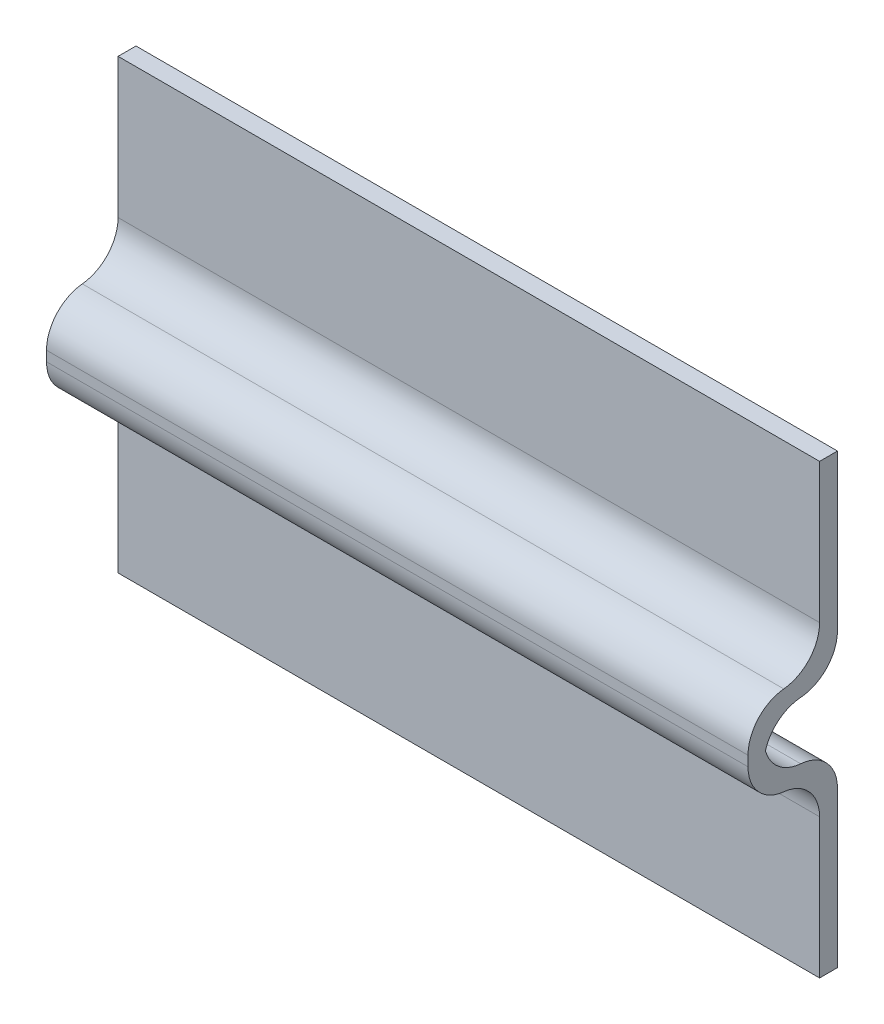
ISO-10303-21;
HEADER;
FILE_DESCRIPTION(('STEP AP214'),'2;1');
FILE_NAME('part.step','',(''),(''),'','','');
FILE_SCHEMA(('AUTOMOTIVE_DESIGN { 1 0 10303 214 1 1 1 1 }'));
ENDSEC;
DATA;
#1=APPLICATION_CONTEXT('core data for automotive mechanical design processes');
#2=APPLICATION_PROTOCOL_DEFINITION('international standard','automotive_design',2000,#1);
#3=PRODUCT_CONTEXT('',#1,'mechanical');
#4=PRODUCT('Part','Part','',(#3));
#5=PRODUCT_RELATED_PRODUCT_CATEGORY('part','',(#4));
#6=PRODUCT_DEFINITION_FORMATION('','',#4);
#7=PRODUCT_DEFINITION_CONTEXT('part definition',#1,'design');
#8=PRODUCT_DEFINITION('design','',#6,#7);
#9=PRODUCT_DEFINITION_SHAPE('','',#8);
#10=(LENGTH_UNIT() NAMED_UNIT(*) SI_UNIT(.MILLI.,.METRE.));
#11=(NAMED_UNIT(*) PLANE_ANGLE_UNIT() SI_UNIT($,.RADIAN.));
#12=(NAMED_UNIT(*) SI_UNIT($,.STERADIAN.) SOLID_ANGLE_UNIT());
#13=UNCERTAINTY_MEASURE_WITH_UNIT(LENGTH_MEASURE(1.E-05),#10,'distance_accuracy_value','');
#14=(GEOMETRIC_REPRESENTATION_CONTEXT(3) GLOBAL_UNCERTAINTY_ASSIGNED_CONTEXT((#13)) GLOBAL_UNIT_ASSIGNED_CONTEXT((#10,
#11,#12)) REPRESENTATION_CONTEXT('',''));
#15=CARTESIAN_POINT('',(0.,0.,0.));
#16=DIRECTION('',(0.,0.,1.));
#17=DIRECTION('',(1.,0.,0.));
#18=AXIS2_PLACEMENT_3D('',#15,#16,#17);
#19=CARTESIAN_POINT('',(-88.265,0.,0.));
#20=DIRECTION('',(0.,0.,-1.));
#21=DIRECTION('',(0.,1.,0.));
#22=AXIS2_PLACEMENT_3D('',#19,#20,#21);
#23=PLANE('',#22);
#24=DIRECTION('',(0.,1.,0.));
#25=VECTOR('',#24,1.);
#26=CARTESIAN_POINT('',(-88.265,0.,0.));
#27=LINE('',#26,#25);
#28=CARTESIAN_POINT('',(-88.265,0.,0.));
#29=VERTEX_POINT('',#28);
#30=CARTESIAN_POINT('',(-88.265,39.0937012998243,0.));
#31=VERTEX_POINT('',#30);
#32=EDGE_CURVE('E161',#29,#31,#27,.T.);
#33=ORIENTED_EDGE('',*,*,#32,.T.);
#34=DIRECTION('',(1.,0.,0.));
#35=VECTOR('',#34,1.);
#36=CARTESIAN_POINT('',(88.265,39.0937012998243,0.));
#37=LINE('',#36,#35);
#38=CARTESIAN_POINT('',(88.265,39.0937012998243,0.));
#39=VERTEX_POINT('',#38);
#40=EDGE_CURVE('E247',#31,#39,#37,.T.);
#41=ORIENTED_EDGE('',*,*,#40,.T.);
#42=DIRECTION('',(0.,1.,0.));
#43=VECTOR('',#42,1.);
#44=CARTESIAN_POINT('',(88.265,0.,0.));
#45=LINE('',#44,#43);
#46=CARTESIAN_POINT('',(88.265,0.,0.));
#47=VERTEX_POINT('',#46);
#48=EDGE_CURVE('E186',#47,#39,#45,.T.);
#49=ORIENTED_EDGE('',*,*,#48,.F.);
#50=DIRECTION('',(1.,0.,0.));
#51=VECTOR('',#50,1.);
#52=CARTESIAN_POINT('',(-88.265,0.,0.));
#53=LINE('',#52,#51);
#54=EDGE_CURVE('E203',#29,#47,#53,.T.);
#55=ORIENTED_EDGE('',*,*,#54,.F.);
#56=EDGE_LOOP('',(#33,#41,#49,#55));
#57=FACE_BOUND('',#56,.T.);
#58=ADVANCED_FACE('F43',(#57),#23,.T.);
#59=CARTESIAN_POINT('',(-88.265,0.,0.));
#60=DIRECTION('',(0.,-1.,0.));
#61=DIRECTION('',(0.,0.,-1.));
#62=AXIS2_PLACEMENT_3D('',#59,#60,#61);
#63=PLANE('',#62);
#64=DIRECTION('',(0.,0.,-1.));
#65=VECTOR('',#64,1.);
#66=CARTESIAN_POINT('',(88.265,0.,0.));
#67=LINE('',#66,#65);
#68=CARTESIAN_POINT('',(88.265,0.,4.50388224287594));
#69=VERTEX_POINT('',#68);
#70=EDGE_CURVE('E200',#69,#47,#67,.T.);
#71=ORIENTED_EDGE('',*,*,#70,.F.);
#72=DIRECTION('',(1.,0.,0.));
#73=VECTOR('',#72,1.);
#74=CARTESIAN_POINT('',(-88.265,0.,4.50388224287594));
#75=LINE('',#74,#73);
#76=CARTESIAN_POINT('',(-88.265,0.,4.50388224287594));
#77=VERTEX_POINT('',#76);
#78=EDGE_CURVE('E206',#77,#69,#75,.T.);
#79=ORIENTED_EDGE('',*,*,#78,.F.);
#80=DIRECTION('',(0.,0.,-1.));
#81=VECTOR('',#80,1.);
#82=CARTESIAN_POINT('',(-88.265,0.,0.));
#83=LINE('',#82,#81);
#84=EDGE_CURVE('E169',#77,#29,#83,.T.);
#85=ORIENTED_EDGE('',*,*,#84,.T.);
#86=ORIENTED_EDGE('',*,*,#54,.T.);
#87=EDGE_LOOP('',(#71,#79,#85,#86));
#88=FACE_BOUND('',#87,.T.);
#89=ADVANCED_FACE('F296',(#88),#63,.T.);
#90=CARTESIAN_POINT('',(-88.265,0.,4.50388224287594));
#91=DIRECTION('',(0.,0.,1.));
#92=DIRECTION('',(0.,-1.,0.));
#93=AXIS2_PLACEMENT_3D('',#90,#91,#92);
#94=PLANE('',#93);
#95=DIRECTION('',(0.,-1.,0.));
#96=VECTOR('',#95,1.);
#97=CARTESIAN_POINT('',(88.265,0.,4.50388224287594));
#98=LINE('',#97,#96);
#99=CARTESIAN_POINT('',(88.265,35.1375190860871,4.50388224287594));
#100=VERTEX_POINT('',#99);
#101=EDGE_CURVE('E198',#100,#69,#98,.T.);
#102=ORIENTED_EDGE('',*,*,#101,.F.);
#103=DIRECTION('',(-1.,0.,0.));
#104=VECTOR('',#103,1.);
#105=CARTESIAN_POINT('',(-88.265,35.1375190860871,4.50388224287594));
#106=LINE('',#105,#104);
#107=CARTESIAN_POINT('',(-88.265,35.1375190860871,4.50388224287594));
#108=VERTEX_POINT('',#107);
#109=EDGE_CURVE('E255',#100,#108,#106,.T.);
#110=ORIENTED_EDGE('',*,*,#109,.T.);
#111=DIRECTION('',(0.,-1.,0.));
#112=VECTOR('',#111,1.);
#113=CARTESIAN_POINT('',(-88.265,0.,4.50388224287594));
#114=LINE('',#113,#112);
#115=EDGE_CURVE('E182',#108,#77,#114,.T.);
#116=ORIENTED_EDGE('',*,*,#115,.T.);
#117=ORIENTED_EDGE('',*,*,#78,.T.);
#118=EDGE_LOOP('',(#102,#110,#116,#117));
#119=FACE_BOUND('',#118,.T.);
#120=ADVANCED_FACE('F327',(#119),#94,.T.);
#121=CARTESIAN_POINT('',(-88.265,67.5582336431391,22.5194112143797));
#122=DIRECTION('',(0.,0.,1.));
#123=DIRECTION('',(1.,0.,0.));
#124=AXIS2_PLACEMENT_3D('',#121,#122,#123);
#125=PLANE('',#124);
#126=DIRECTION('',(0.,-1.,0.));
#127=VECTOR('',#126,1.);
#128=CARTESIAN_POINT('',(-88.265,67.5582336431391,22.5194112143797));
#129=LINE('',#128,#127);
#130=CARTESIAN_POINT('',(-88.265,57.5582336431391,22.5194112143797));
#131=VERTEX_POINT('',#130);
#132=CARTESIAN_POINT('',(-88.265,55.0388224287594,22.5194112143797));
#133=VERTEX_POINT('',#132);
#134=EDGE_CURVE('E176',#131,#133,#129,.T.);
#135=ORIENTED_EDGE('',*,*,#134,.T.);
#136=DIRECTION('',(1.,0.,0.));
#137=VECTOR('',#136,1.);
#138=CARTESIAN_POINT('',(-88.265,55.0388224287594,22.5194112143797));
#139=LINE('',#138,#137);
#140=CARTESIAN_POINT('',(88.265,55.0388224287594,22.5194112143797));
#141=VERTEX_POINT('',#140);
#142=EDGE_CURVE('E211',#133,#141,#139,.T.);
#143=ORIENTED_EDGE('',*,*,#142,.T.);
#144=DIRECTION('',(0.,-1.,0.));
#145=VECTOR('',#144,1.);
#146=CARTESIAN_POINT('',(88.265,67.5582336431391,22.5194112143797));
#147=LINE('',#146,#145);
#148=CARTESIAN_POINT('',(88.265,57.5582336431391,22.5194112143797));
#149=VERTEX_POINT('',#148);
#150=EDGE_CURVE('E195',#149,#141,#147,.T.);
#151=ORIENTED_EDGE('',*,*,#150,.F.);
#152=DIRECTION('',(1.,0.,0.));
#153=VECTOR('',#152,1.);
#154=CARTESIAN_POINT('',(-88.265,57.5582336431391,22.5194112143797));
#155=LINE('',#154,#153);
#156=EDGE_CURVE('E205',#149,#131,#155,.F.);
#157=ORIENTED_EDGE('',*,*,#156,.T.);
#158=EDGE_LOOP('',(#135,#143,#151,#157));
#159=FACE_BOUND('',#158,.T.);
#160=ADVANCED_FACE('F312',(#159),#125,.T.);
#161=CARTESIAN_POINT('',(-88.265,67.5582336431391,4.50388224287594));
#162=DIRECTION('',(0.,0.,1.));
#163=DIRECTION('',(0.,-1.,0.));
#164=AXIS2_PLACEMENT_3D('',#161,#162,#163);
#165=PLANE('',#164);
#166=DIRECTION('',(0.,-1.,0.));
#167=VECTOR('',#166,1.);
#168=CARTESIAN_POINT('',(-88.265,67.5582336431391,4.50388224287594));
#169=LINE('',#168,#167);
#170=CARTESIAN_POINT('',(-88.265,112.597056071899,4.50388224287594));
#171=VERTEX_POINT('',#170);
#172=CARTESIAN_POINT('',(-88.265,77.4595369858114,4.50388224287594));
#173=VERTEX_POINT('',#172);
#174=EDGE_CURVE('E174',#171,#173,#169,.T.);
#175=ORIENTED_EDGE('',*,*,#174,.T.);
#176=DIRECTION('',(-1.,0.,0.));
#177=VECTOR('',#176,1.);
#178=CARTESIAN_POINT('',(88.265,77.4595369858114,4.50388224287594));
#179=LINE('',#178,#177);
#180=CARTESIAN_POINT('',(88.265,77.4595369858114,4.50388224287594));
#181=VERTEX_POINT('',#180);
#182=EDGE_CURVE('E261',#173,#181,#179,.F.);
#183=ORIENTED_EDGE('',*,*,#182,.T.);
#184=DIRECTION('',(0.,-1.,0.));
#185=VECTOR('',#184,1.);
#186=CARTESIAN_POINT('',(88.265,67.5582336431391,4.50388224287594));
#187=LINE('',#186,#185);
#188=CARTESIAN_POINT('',(88.265,112.597056071899,4.50388224287594));
#189=VERTEX_POINT('',#188);
#190=EDGE_CURVE('E193',#189,#181,#187,.T.);
#191=ORIENTED_EDGE('',*,*,#190,.F.);
#192=DIRECTION('',(1.,0.,0.));
#193=VECTOR('',#192,1.);
#194=CARTESIAN_POINT('',(-88.265,112.597056071899,4.50388224287594));
#195=LINE('',#194,#193);
#196=EDGE_CURVE('E168',#171,#189,#195,.T.);
#197=ORIENTED_EDGE('',*,*,#196,.F.);
#198=EDGE_LOOP('',(#175,#183,#191,#197));
#199=FACE_BOUND('',#198,.T.);
#200=ADVANCED_FACE('F267',(#199),#165,.T.);
#201=CARTESIAN_POINT('',(-88.265,112.597056071899,0.));
#202=DIRECTION('',(0.,1.,0.));
#203=DIRECTION('',(0.,0.,1.));
#204=AXIS2_PLACEMENT_3D('',#201,#202,#203);
#205=PLANE('',#204);
#206=DIRECTION('',(0.,0.,1.));
#207=VECTOR('',#206,1.);
#208=CARTESIAN_POINT('',(88.265,112.597056071899,0.));
#209=LINE('',#208,#207);
#210=CARTESIAN_POINT('',(88.265,112.597056071899,0.));
#211=VERTEX_POINT('',#210);
#212=EDGE_CURVE('E167',#211,#189,#209,.T.);
#213=ORIENTED_EDGE('',*,*,#212,.F.);
#214=DIRECTION('',(1.,0.,0.));
#215=VECTOR('',#214,1.);
#216=CARTESIAN_POINT('',(-88.265,112.597056071899,0.));
#217=LINE('',#216,#215);
#218=CARTESIAN_POINT('',(-88.265,112.597056071899,0.));
#219=VERTEX_POINT('',#218);
#220=EDGE_CURVE('E153',#219,#211,#217,.T.);
#221=ORIENTED_EDGE('',*,*,#220,.F.);
#222=DIRECTION('',(0.,0.,1.));
#223=VECTOR('',#222,1.);
#224=CARTESIAN_POINT('',(-88.265,112.597056071899,0.));
#225=LINE('',#224,#223);
#226=EDGE_CURVE('E160',#219,#171,#225,.T.);
#227=ORIENTED_EDGE('',*,*,#226,.T.);
#228=ORIENTED_EDGE('',*,*,#196,.T.);
#229=EDGE_LOOP('',(#213,#221,#227,#228));
#230=FACE_BOUND('',#229,.T.);
#231=ADVANCED_FACE('F165',(#230),#205,.T.);
#232=CARTESIAN_POINT('',(-88.265,63.5582336431391,0.));
#233=DIRECTION('',(0.,0.,-1.));
#234=DIRECTION('',(-1.,0.,0.));
#235=AXIS2_PLACEMENT_3D('',#232,#233,#234);
#236=PLANE('',#235);
#237=DIRECTION('',(0.,1.,0.));
#238=VECTOR('',#237,1.);
#239=CARTESIAN_POINT('',(88.265,63.5582336431391,0.));
#240=LINE('',#239,#238);
#241=CARTESIAN_POINT('',(88.265,73.5033547720743,0.));
#242=VERTEX_POINT('',#241);
#243=EDGE_CURVE('E189',#242,#211,#240,.T.);
#244=ORIENTED_EDGE('',*,*,#243,.F.);
#245=DIRECTION('',(1.,0.,0.));
#246=VECTOR('',#245,1.);
#247=CARTESIAN_POINT('',(-88.265,73.5033547720743,0.));
#248=LINE('',#247,#246);
#249=CARTESIAN_POINT('',(-88.265,73.5033547720743,0.));
#250=VERTEX_POINT('',#249);
#251=EDGE_CURVE('E156',#242,#250,#248,.F.);
#252=ORIENTED_EDGE('',*,*,#251,.T.);
#253=DIRECTION('',(0.,1.,0.));
#254=VECTOR('',#253,1.);
#255=CARTESIAN_POINT('',(-88.265,63.5582336431391,0.));
#256=LINE('',#255,#254);
#257=EDGE_CURVE('E149',#250,#219,#256,.T.);
#258=ORIENTED_EDGE('',*,*,#257,.T.);
#259=ORIENTED_EDGE('',*,*,#220,.T.);
#260=EDGE_LOOP('',(#244,#252,#258,#259));
#261=FACE_BOUND('',#260,.T.);
#262=ADVANCED_FACE('F152',(#261),#236,.T.);
#263=CARTESIAN_POINT('',(-88.265,0.,0.));
#264=DIRECTION('',(-1.,0.,0.));
#265=DIRECTION('',(0.,0.,1.));
#266=AXIS2_PLACEMENT_3D('',#263,#264,#265);
#267=PLANE('',#266);
#268=ORIENTED_EDGE('',*,*,#257,.F.);
#269=CARTESIAN_POINT('',(-88.265,73.5033547720743,10.));
#270=DIRECTION('',(-1.,0.,0.));
#271=DIRECTION('',(0.,0.,1.));
#272=AXIS2_PLACEMENT_3D('',#269,#270,#271);
#273=CIRCLE('',#272,10.);
#274=CARTESIAN_POINT('',(-88.265,63.5307942076067,9.25970560718985));
#275=VERTEX_POINT('',#274);
#276=EDGE_CURVE('E245',#250,#275,#273,.T.);
#277=ORIENTED_EDGE('',*,*,#276,.T.);
#278=CARTESIAN_POINT('',(-88.265,53.5582336431391,8.51941121437971));
#279=DIRECTION('',(-1.,0.,0.));
#280=DIRECTION('',(0.,0.,1.));
#281=AXIS2_PLACEMENT_3D('',#278,#279,#280);
#282=CIRCLE('',#281,10.);
#283=CARTESIAN_POINT('',(-88.265,56.2985280359493,18.1366242535472));
#284=VERTEX_POINT('',#283);
#285=EDGE_CURVE('E231',#275,#284,#282,.F.);
#286=ORIENTED_EDGE('',*,*,#285,.T.);
#287=CARTESIAN_POINT('',(-88.265,59.0388224287594,8.51941121437971));
#288=DIRECTION('',(-1.,0.,0.));
#289=DIRECTION('',(0.,0.,1.));
#290=AXIS2_PLACEMENT_3D('',#287,#288,#289);
#291=CIRCLE('',#290,10.);
#292=CARTESIAN_POINT('',(-88.265,49.0662618642918,9.25970560718985));
#293=VERTEX_POINT('',#292);
#294=EDGE_CURVE('E225',#284,#293,#291,.F.);
#295=ORIENTED_EDGE('',*,*,#294,.T.);
#296=CARTESIAN_POINT('',(-88.265,39.0937012998243,10.));
#297=DIRECTION('',(-1.,0.,0.));
#298=DIRECTION('',(0.,0.,1.));
#299=AXIS2_PLACEMENT_3D('',#296,#297,#298);
#300=CIRCLE('',#299,10.);
#301=EDGE_CURVE('E243',#293,#31,#300,.T.);
#302=ORIENTED_EDGE('',*,*,#301,.T.);
#303=ORIENTED_EDGE('',*,*,#32,.F.);
#304=ORIENTED_EDGE('',*,*,#84,.F.);
#305=ORIENTED_EDGE('',*,*,#115,.F.);
#306=CARTESIAN_POINT('',(-88.265,35.1375190860871,14.5038822428759));
#307=DIRECTION('',(-1.,0.,0.));
#308=DIRECTION('',(0.,0.,1.));
#309=AXIS2_PLACEMENT_3D('',#306,#307,#308);
#310=CIRCLE('',#309,10.);
#311=CARTESIAN_POINT('',(-88.265,45.0881707574233,13.5116467286278));
#312=VERTEX_POINT('',#311);
#313=EDGE_CURVE('E259',#108,#312,#310,.F.);
#314=ORIENTED_EDGE('',*,*,#313,.T.);
#315=CARTESIAN_POINT('',(-88.265,55.0388224287594,12.5194112143797));
#316=DIRECTION('',(-1.,0.,0.));
#317=DIRECTION('',(0.,0.,1.));
#318=AXIS2_PLACEMENT_3D('',#315,#316,#317);
#319=CIRCLE('',#318,10.);
#320=EDGE_CURVE('E221',#312,#133,#319,.T.);
#321=ORIENTED_EDGE('',*,*,#320,.T.);
#322=ORIENTED_EDGE('',*,*,#134,.F.);
#323=CARTESIAN_POINT('',(-88.265,57.5582336431391,12.5194112143797));
#324=DIRECTION('',(-1.,0.,0.));
#325=DIRECTION('',(0.,0.,1.));
#326=AXIS2_PLACEMENT_3D('',#323,#324,#325);
#327=CIRCLE('',#326,10.);
#328=CARTESIAN_POINT('',(-88.265,67.5088853144753,13.5116467286278));
#329=VERTEX_POINT('',#328);
#330=EDGE_CURVE('E219',#131,#329,#327,.T.);
#331=ORIENTED_EDGE('',*,*,#330,.T.);
#332=CARTESIAN_POINT('',(-88.265,77.4595369858114,14.5038822428759));
#333=DIRECTION('',(-1.,0.,0.));
#334=DIRECTION('',(0.,0.,1.));
#335=AXIS2_PLACEMENT_3D('',#332,#333,#334);
#336=CIRCLE('',#335,10.);
#337=EDGE_CURVE('E11',#329,#173,#336,.F.);
#338=ORIENTED_EDGE('',*,*,#337,.T.);
#339=ORIENTED_EDGE('',*,*,#174,.F.);
#340=ORIENTED_EDGE('',*,*,#226,.F.);
#341=EDGE_LOOP('',(#268,#277,#286,#295,#302,#303,#304,#305,#314,#321,#322,#331,#338,#339,#340));
#342=FACE_BOUND('',#341,.T.);
#343=ADVANCED_FACE('F172',(#342),#267,.T.);
#344=CARTESIAN_POINT('',(88.265,0.,0.));
#345=DIRECTION('',(-1.,0.,0.));
#346=DIRECTION('',(0.,0.,1.));
#347=AXIS2_PLACEMENT_3D('',#344,#345,#346);
#348=PLANE('',#347);
#349=CARTESIAN_POINT('',(88.265,53.5582336431391,8.51941121437971));
#350=DIRECTION('',(-1.,0.,0.));
#351=DIRECTION('',(0.,0.,1.));
#352=AXIS2_PLACEMENT_3D('',#349,#350,#351);
#353=CIRCLE('',#352,10.);
#354=CARTESIAN_POINT('',(88.265,56.2985280359493,18.1366242535472));
#355=VERTEX_POINT('',#354);
#356=CARTESIAN_POINT('',(88.265,63.5307942076067,9.25970560718985));
#357=VERTEX_POINT('',#356);
#358=EDGE_CURVE('E228',#355,#357,#353,.T.);
#359=ORIENTED_EDGE('',*,*,#358,.T.);
#360=CARTESIAN_POINT('',(88.265,73.5033547720743,10.));
#361=DIRECTION('',(-1.,0.,0.));
#362=DIRECTION('',(0.,0.,1.));
#363=AXIS2_PLACEMENT_3D('',#360,#361,#362);
#364=CIRCLE('',#363,10.);
#365=EDGE_CURVE('E240',#357,#242,#364,.F.);
#366=ORIENTED_EDGE('',*,*,#365,.T.);
#367=ORIENTED_EDGE('',*,*,#243,.T.);
#368=ORIENTED_EDGE('',*,*,#212,.T.);
#369=ORIENTED_EDGE('',*,*,#190,.T.);
#370=CARTESIAN_POINT('',(88.265,77.4595369858114,14.5038822428759));
#371=DIRECTION('',(-1.,0.,0.));
#372=DIRECTION('',(0.,0.,1.));
#373=AXIS2_PLACEMENT_3D('',#370,#371,#372);
#374=CIRCLE('',#373,10.);
#375=CARTESIAN_POINT('',(88.265,67.5088853144753,13.5116467286278));
#376=VERTEX_POINT('',#375);
#377=EDGE_CURVE('E51',#181,#376,#374,.T.);
#378=ORIENTED_EDGE('',*,*,#377,.T.);
#379=CARTESIAN_POINT('',(88.265,57.5582336431391,12.5194112143797));
#380=DIRECTION('',(-1.,0.,0.));
#381=DIRECTION('',(0.,0.,1.));
#382=AXIS2_PLACEMENT_3D('',#379,#380,#381);
#383=CIRCLE('',#382,10.);
#384=EDGE_CURVE('E214',#376,#149,#383,.F.);
#385=ORIENTED_EDGE('',*,*,#384,.T.);
#386=ORIENTED_EDGE('',*,*,#150,.T.);
#387=CARTESIAN_POINT('',(88.265,55.0388224287594,12.5194112143797));
#388=DIRECTION('',(-1.,0.,0.));
#389=DIRECTION('',(0.,0.,1.));
#390=AXIS2_PLACEMENT_3D('',#387,#388,#389);
#391=CIRCLE('',#390,10.);
#392=CARTESIAN_POINT('',(88.265,45.0881707574233,13.5116467286278));
#393=VERTEX_POINT('',#392);
#394=EDGE_CURVE('E216',#141,#393,#391,.F.);
#395=ORIENTED_EDGE('',*,*,#394,.T.);
#396=CARTESIAN_POINT('',(88.265,35.1375190860871,14.5038822428759));
#397=DIRECTION('',(-1.,0.,0.));
#398=DIRECTION('',(0.,0.,1.));
#399=AXIS2_PLACEMENT_3D('',#396,#397,#398);
#400=CIRCLE('',#399,10.);
#401=EDGE_CURVE('E257',#393,#100,#400,.T.);
#402=ORIENTED_EDGE('',*,*,#401,.T.);
#403=ORIENTED_EDGE('',*,*,#101,.T.);
#404=ORIENTED_EDGE('',*,*,#70,.T.);
#405=ORIENTED_EDGE('',*,*,#48,.T.);
#406=CARTESIAN_POINT('',(88.265,39.0937012998243,10.));
#407=DIRECTION('',(-1.,0.,0.));
#408=DIRECTION('',(0.,0.,1.));
#409=AXIS2_PLACEMENT_3D('',#406,#407,#408);
#410=CIRCLE('',#409,10.);
#411=CARTESIAN_POINT('',(88.265,49.0662618642918,9.25970560718985));
#412=VERTEX_POINT('',#411);
#413=EDGE_CURVE('E238',#39,#412,#410,.F.);
#414=ORIENTED_EDGE('',*,*,#413,.T.);
#415=CARTESIAN_POINT('',(88.265,59.0388224287594,8.51941121437971));
#416=DIRECTION('',(-1.,0.,0.));
#417=DIRECTION('',(0.,0.,1.));
#418=AXIS2_PLACEMENT_3D('',#415,#416,#417);
#419=CIRCLE('',#418,10.);
#420=EDGE_CURVE('E223',#412,#355,#419,.T.);
#421=ORIENTED_EDGE('',*,*,#420,.T.);
#422=EDGE_LOOP('',(#359,#366,#367,#368,#369,#378,#385,#386,#395,#402,#403,#404,#405,#414,#421));
#423=FACE_BOUND('',#422,.T.);
#424=ADVANCED_FACE('F270',(#423),#348,.F.);
#425=CARTESIAN_POINT('',(-88.265,55.0388224287594,12.5194112143797));
#426=DIRECTION('',(1.,0.,0.));
#427=DIRECTION('',(0.,0.,-1.));
#428=AXIS2_PLACEMENT_3D('',#425,#426,#427);
#429=CYLINDRICAL_SURFACE('',#428,10.);
#430=ORIENTED_EDGE('',*,*,#320,.F.);
#431=DIRECTION('',(1.,0.,0.));
#432=VECTOR('',#431,1.);
#433=CARTESIAN_POINT('',(-88.265,45.0881707574233,13.5116467286278));
#434=LINE('',#433,#432);
#435=EDGE_CURVE('E252',#312,#393,#434,.T.);
#436=ORIENTED_EDGE('',*,*,#435,.T.);
#437=ORIENTED_EDGE('',*,*,#394,.F.);
#438=ORIENTED_EDGE('',*,*,#142,.F.);
#439=EDGE_LOOP('',(#430,#436,#437,#438));
#440=FACE_BOUND('',#439,.T.);
#441=ADVANCED_FACE('F307',(#440),#429,.T.);
#442=CARTESIAN_POINT('',(-88.265,57.5582336431391,12.5194112143797));
#443=DIRECTION('',(1.,0.,0.));
#444=DIRECTION('',(0.,0.,-1.));
#445=AXIS2_PLACEMENT_3D('',#442,#443,#444);
#446=CYLINDRICAL_SURFACE('',#445,10.);
#447=ORIENTED_EDGE('',*,*,#384,.F.);
#448=DIRECTION('',(1.,0.,0.));
#449=VECTOR('',#448,1.);
#450=CARTESIAN_POINT('',(-88.265,67.5088853144753,13.5116467286278));
#451=LINE('',#450,#449);
#452=EDGE_CURVE('E64',#376,#329,#451,.F.);
#453=ORIENTED_EDGE('',*,*,#452,.T.);
#454=ORIENTED_EDGE('',*,*,#330,.F.);
#455=ORIENTED_EDGE('',*,*,#156,.F.);
#456=EDGE_LOOP('',(#447,#453,#454,#455));
#457=FACE_BOUND('',#456,.T.);
#458=ADVANCED_FACE('F314',(#457),#446,.T.);
#459=CARTESIAN_POINT('',(-88.265,53.5582336431391,8.51941121437971));
#460=DIRECTION('',(-1.,0.,0.));
#461=DIRECTION('',(0.,0.,1.));
#462=AXIS2_PLACEMENT_3D('',#459,#460,#461);
#463=CYLINDRICAL_SURFACE('',#462,10.);
#464=ORIENTED_EDGE('',*,*,#285,.F.);
#465=DIRECTION('',(-1.,0.,0.));
#466=VECTOR('',#465,1.);
#467=CARTESIAN_POINT('',(-88.265,63.5307942076067,9.25970560718985));
#468=LINE('',#467,#466);
#469=EDGE_CURVE('E233',#275,#357,#468,.F.);
#470=ORIENTED_EDGE('',*,*,#469,.T.);
#471=ORIENTED_EDGE('',*,*,#358,.F.);
#472=DIRECTION('',(-1.,0.,0.));
#473=VECTOR('',#472,1.);
#474=CARTESIAN_POINT('',(0.,56.2985280359493,18.1366242535472));
#475=LINE('',#474,#473);
#476=EDGE_CURVE('E190',#284,#355,#475,.F.);
#477=ORIENTED_EDGE('',*,*,#476,.F.);
#478=EDGE_LOOP('',(#464,#470,#471,#477));
#479=FACE_BOUND('',#478,.T.);
#480=ADVANCED_FACE('F277',(#479),#463,.F.);
#481=CARTESIAN_POINT('',(-88.265,59.0388224287594,8.51941121437971));
#482=DIRECTION('',(-1.,0.,0.));
#483=DIRECTION('',(0.,0.,1.));
#484=AXIS2_PLACEMENT_3D('',#481,#482,#483);
#485=CYLINDRICAL_SURFACE('',#484,10.);
#486=ORIENTED_EDGE('',*,*,#420,.F.);
#487=DIRECTION('',(-1.,0.,0.));
#488=VECTOR('',#487,1.);
#489=CARTESIAN_POINT('',(-88.265,49.0662618642918,9.25970560718985));
#490=LINE('',#489,#488);
#491=EDGE_CURVE('E250',#412,#293,#490,.T.);
#492=ORIENTED_EDGE('',*,*,#491,.T.);
#493=ORIENTED_EDGE('',*,*,#294,.F.);
#494=ORIENTED_EDGE('',*,*,#476,.T.);
#495=EDGE_LOOP('',(#486,#492,#493,#494));
#496=FACE_BOUND('',#495,.T.);
#497=ADVANCED_FACE('F282',(#496),#485,.F.);
#498=CARTESIAN_POINT('',(-88.265,73.5033547720743,10.));
#499=DIRECTION('',(-1.,0.,0.));
#500=DIRECTION('',(0.,0.,1.));
#501=AXIS2_PLACEMENT_3D('',#498,#499,#500);
#502=CYLINDRICAL_SURFACE('',#501,10.);
#503=ORIENTED_EDGE('',*,*,#276,.F.);
#504=ORIENTED_EDGE('',*,*,#251,.F.);
#505=ORIENTED_EDGE('',*,*,#365,.F.);
#506=ORIENTED_EDGE('',*,*,#469,.F.);
#507=EDGE_LOOP('',(#503,#504,#505,#506));
#508=FACE_BOUND('',#507,.T.);
#509=ADVANCED_FACE('F272',(#508),#502,.T.);
#510=CARTESIAN_POINT('',(-88.265,39.0937012998243,10.));
#511=DIRECTION('',(-1.,0.,0.));
#512=DIRECTION('',(0.,0.,1.));
#513=AXIS2_PLACEMENT_3D('',#510,#511,#512);
#514=CYLINDRICAL_SURFACE('',#513,10.);
#515=ORIENTED_EDGE('',*,*,#301,.F.);
#516=ORIENTED_EDGE('',*,*,#491,.F.);
#517=ORIENTED_EDGE('',*,*,#413,.F.);
#518=ORIENTED_EDGE('',*,*,#40,.F.);
#519=EDGE_LOOP('',(#515,#516,#517,#518));
#520=FACE_BOUND('',#519,.T.);
#521=ADVANCED_FACE('F289',(#520),#514,.T.);
#522=CARTESIAN_POINT('',(-88.265,35.1375190860871,14.5038822428759));
#523=DIRECTION('',(1.,0.,0.));
#524=DIRECTION('',(0.,0.,-1.));
#525=AXIS2_PLACEMENT_3D('',#522,#523,#524);
#526=CYLINDRICAL_SURFACE('',#525,10.);
#527=ORIENTED_EDGE('',*,*,#313,.F.);
#528=ORIENTED_EDGE('',*,*,#109,.F.);
#529=ORIENTED_EDGE('',*,*,#401,.F.);
#530=ORIENTED_EDGE('',*,*,#435,.F.);
#531=EDGE_LOOP('',(#527,#528,#529,#530));
#532=FACE_BOUND('',#531,.T.);
#533=ADVANCED_FACE('F305',(#532),#526,.F.);
#534=CARTESIAN_POINT('',(-88.265,77.4595369858114,14.5038822428759));
#535=DIRECTION('',(1.,0.,0.));
#536=DIRECTION('',(0.,0.,-1.));
#537=AXIS2_PLACEMENT_3D('',#534,#535,#536);
#538=CYLINDRICAL_SURFACE('',#537,10.);
#539=ORIENTED_EDGE('',*,*,#337,.F.);
#540=ORIENTED_EDGE('',*,*,#452,.F.);
#541=ORIENTED_EDGE('',*,*,#377,.F.);
#542=ORIENTED_EDGE('',*,*,#182,.F.);
#543=EDGE_LOOP('',(#539,#540,#541,#542));
#544=FACE_BOUND('',#543,.T.);
#545=ADVANCED_FACE('F45',(#544),#538,.F.);
#546=CLOSED_SHELL('',(#58,#89,#120,#160,#200,#231,#262,#343,#424,#441,#458,#480,#497,#509,#521,
#533,#545));
#547=MANIFOLD_SOLID_BREP('B2',#546);
#548=ADVANCED_BREP_SHAPE_REPRESENTATION('',(#18,#547),#14);
#549=SHAPE_DEFINITION_REPRESENTATION(#9,#548);
ENDSEC;
END-ISO-10303-21;
